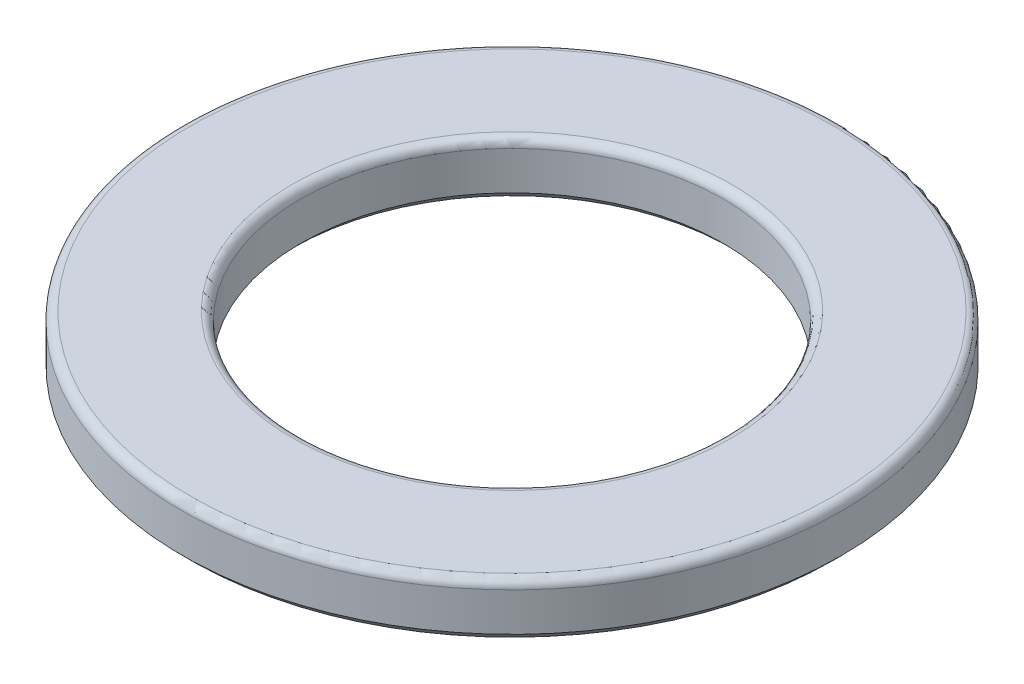
ISO-10303-21;
HEADER;
FILE_DESCRIPTION(('STEP AP214'),'2;1');
FILE_NAME('part.step','',(''),(''),'','','');
FILE_SCHEMA(('AUTOMOTIVE_DESIGN { 1 0 10303 214 1 1 1 1 }'));
ENDSEC;
DATA;
#1=APPLICATION_CONTEXT('core data for automotive mechanical design processes');
#2=APPLICATION_PROTOCOL_DEFINITION('international standard','automotive_design',2000,#1);
#3=PRODUCT_CONTEXT('',#1,'mechanical');
#4=PRODUCT('Part','Part','',(#3));
#5=PRODUCT_RELATED_PRODUCT_CATEGORY('part','',(#4));
#6=PRODUCT_DEFINITION_FORMATION('','',#4);
#7=PRODUCT_DEFINITION_CONTEXT('part definition',#1,'design');
#8=PRODUCT_DEFINITION('design','',#6,#7);
#9=PRODUCT_DEFINITION_SHAPE('','',#8);
#10=(LENGTH_UNIT() NAMED_UNIT(*) SI_UNIT(.MILLI.,.METRE.));
#11=(NAMED_UNIT(*) PLANE_ANGLE_UNIT() SI_UNIT($,.RADIAN.));
#12=(NAMED_UNIT(*) SI_UNIT($,.STERADIAN.) SOLID_ANGLE_UNIT());
#13=UNCERTAINTY_MEASURE_WITH_UNIT(LENGTH_MEASURE(1.E-05),#10,'distance_accuracy_value','');
#14=(GEOMETRIC_REPRESENTATION_CONTEXT(3) GLOBAL_UNCERTAINTY_ASSIGNED_CONTEXT((#13)) GLOBAL_UNIT_ASSIGNED_CONTEXT((#10,
#11,#12)) REPRESENTATION_CONTEXT('',''));
#15=CARTESIAN_POINT('',(0.,0.,0.));
#16=DIRECTION('',(0.,0.,1.));
#17=DIRECTION('',(1.,0.,0.));
#18=AXIS2_PLACEMENT_3D('',#15,#16,#17);
#19=CARTESIAN_POINT('',(32.,22.,0.));
#20=DIRECTION('',(0.,1.,0.));
#21=DIRECTION('',(-1.,0.,0.));
#22=AXIS2_PLACEMENT_3D('',#19,#20,#21);
#23=PLANE('',#22);
#24=CARTESIAN_POINT('',(0.,22.,0.));
#25=DIRECTION('',(0.,-1.,0.));
#26=DIRECTION('',(1.,0.,0.));
#27=AXIS2_PLACEMENT_3D('',#24,#25,#26);
#28=CIRCLE('',#27,26.);
#29=CARTESIAN_POINT('',(26.,22.,0.));
#30=VERTEX_POINT('',#29);
#31=EDGE_CURVE('E11',#30,#30,#28,.T.);
#32=ORIENTED_EDGE('',*,*,#31,.T.);
#33=EDGE_LOOP('',(#32));
#34=FACE_BOUND('',#33,.T.);
#35=CARTESIAN_POINT('',(0.,22.,0.));
#36=DIRECTION('',(0.,-1.,0.));
#37=DIRECTION('',(1.,0.,0.));
#38=AXIS2_PLACEMENT_3D('',#35,#36,#37);
#39=CIRCLE('',#38,38.);
#40=CARTESIAN_POINT('',(38.,22.,0.));
#41=VERTEX_POINT('',#40);
#42=EDGE_CURVE('E67',#41,#41,#39,.T.);
#43=ORIENTED_EDGE('',*,*,#42,.F.);
#44=EDGE_LOOP('',(#43));
#45=FACE_BOUND('',#44,.T.);
#46=ADVANCED_FACE('F17',(#34,#45),#23,.T.);
#47=CARTESIAN_POINT('',(0.,21.,0.));
#48=DIRECTION('',(0.,-1.,0.));
#49=DIRECTION('',(0.,0.,-1.));
#50=AXIS2_PLACEMENT_3D('',#47,#48,#49);
#51=TOROIDAL_SURFACE('',#50,26.,1.);
#52=CARTESIAN_POINT('',(0.,21.,0.));
#53=DIRECTION('',(0.,-1.,0.));
#54=DIRECTION('',(1.,0.,0.));
#55=AXIS2_PLACEMENT_3D('',#52,#53,#54);
#56=CIRCLE('',#55,25.);
#57=CARTESIAN_POINT('',(25.,21.,0.));
#58=VERTEX_POINT('',#57);
#59=EDGE_CURVE('E26',#58,#58,#56,.T.);
#60=ORIENTED_EDGE('',*,*,#59,.T.);
#61=EDGE_LOOP('',(#60));
#62=FACE_BOUND('',#61,.T.);
#63=ORIENTED_EDGE('',*,*,#31,.F.);
#64=EDGE_LOOP('',(#63));
#65=FACE_BOUND('',#64,.T.);
#66=ADVANCED_FACE('F104',(#62,#65),#51,.T.);
#67=CARTESIAN_POINT('',(0.,18.7224,0.));
#68=DIRECTION('',(0.,1.,0.));
#69=DIRECTION('',(1.,0.,0.));
#70=AXIS2_PLACEMENT_3D('',#67,#68,#69);
#71=CYLINDRICAL_SURFACE('',#70,25.);
#72=CARTESIAN_POINT('',(0.,16.4448,0.));
#73=DIRECTION('',(0.,-1.,0.));
#74=DIRECTION('',(1.,0.,0.));
#75=AXIS2_PLACEMENT_3D('',#72,#73,#74);
#76=CIRCLE('',#75,25.);
#77=CARTESIAN_POINT('',(25.,16.4448,0.));
#78=VERTEX_POINT('',#77);
#79=EDGE_CURVE('E75',#78,#78,#76,.T.);
#80=ORIENTED_EDGE('',*,*,#79,.T.);
#81=EDGE_LOOP('',(#80));
#82=FACE_BOUND('',#81,.T.);
#83=ORIENTED_EDGE('',*,*,#59,.F.);
#84=EDGE_LOOP('',(#83));
#85=FACE_BOUND('',#84,.T.);
#86=ADVANCED_FACE('F108',(#82,#85),#71,.F.);
#87=CARTESIAN_POINT('',(0.,15.9448,0.));
#88=DIRECTION('',(0.,-1.,0.));
#89=DIRECTION('',(1.,0.,0.));
#90=AXIS2_PLACEMENT_3D('',#87,#88,#89);
#91=CONICAL_SURFACE('',#90,25.5,0.78539816339745);
#92=CARTESIAN_POINT('',(0.,15.4448,0.));
#93=DIRECTION('',(0.,-1.,0.));
#94=DIRECTION('',(1.,0.,0.));
#95=AXIS2_PLACEMENT_3D('',#92,#93,#94);
#96=CIRCLE('',#95,26.);
#97=CARTESIAN_POINT('',(26.,15.4448,0.));
#98=VERTEX_POINT('',#97);
#99=EDGE_CURVE('E78',#98,#98,#96,.T.);
#100=ORIENTED_EDGE('',*,*,#99,.T.);
#101=EDGE_LOOP('',(#100));
#102=FACE_BOUND('',#101,.T.);
#103=ORIENTED_EDGE('',*,*,#79,.F.);
#104=EDGE_LOOP('',(#103));
#105=FACE_BOUND('',#104,.T.);
#106=ADVANCED_FACE('F115',(#102,#105),#91,.F.);
#107=CARTESIAN_POINT('',(27.3332,15.4448,0.));
#108=DIRECTION('',(0.,-1.,0.));
#109=DIRECTION('',(1.,0.,0.));
#110=AXIS2_PLACEMENT_3D('',#107,#108,#109);
#111=PLANE('',#110);
#112=CARTESIAN_POINT('',(0.,15.4448,0.));
#113=DIRECTION('',(0.,-1.,0.));
#114=DIRECTION('',(1.,0.,0.));
#115=AXIS2_PLACEMENT_3D('',#112,#113,#114);
#116=CIRCLE('',#115,28.6664);
#117=CARTESIAN_POINT('',(28.6664,15.4448,0.));
#118=VERTEX_POINT('',#117);
#119=EDGE_CURVE('E54',#118,#118,#116,.T.);
#120=ORIENTED_EDGE('',*,*,#119,.T.);
#121=EDGE_LOOP('',(#120));
#122=FACE_BOUND('',#121,.T.);
#123=ORIENTED_EDGE('',*,*,#99,.F.);
#124=EDGE_LOOP('',(#123));
#125=FACE_BOUND('',#124,.T.);
#126=ADVANCED_FACE('F120',(#122,#125),#111,.T.);
#127=CARTESIAN_POINT('',(0.,11.,0.));
#128=DIRECTION('',(0.,-1.,0.));
#129=DIRECTION('',(0.,0.,-1.));
#130=AXIS2_PLACEMENT_3D('',#127,#128,#129);
#131=TOROIDAL_SURFACE('',#130,32.,5.556);
#132=CARTESIAN_POINT('',(0.,15.4448,0.));
#133=DIRECTION('',(0.,-1.,0.));
#134=DIRECTION('',(1.,0.,0.));
#135=AXIS2_PLACEMENT_3D('',#132,#133,#134);
#136=CIRCLE('',#135,35.3336);
#137=CARTESIAN_POINT('',(35.3336,15.4448,0.));
#138=VERTEX_POINT('',#137);
#139=EDGE_CURVE('E58',#138,#138,#136,.T.);
#140=ORIENTED_EDGE('',*,*,#139,.T.);
#141=EDGE_LOOP('',(#140));
#142=FACE_BOUND('',#141,.T.);
#143=ORIENTED_EDGE('',*,*,#119,.F.);
#144=EDGE_LOOP('',(#143));
#145=FACE_BOUND('',#144,.T.);
#146=ADVANCED_FACE('F124',(#142,#145),#131,.F.);
#147=CARTESIAN_POINT('',(36.6668,15.4448,0.));
#148=DIRECTION('',(0.,-1.,0.));
#149=DIRECTION('',(1.,0.,0.));
#150=AXIS2_PLACEMENT_3D('',#147,#148,#149);
#151=PLANE('',#150);
#152=CARTESIAN_POINT('',(0.,15.4448,0.));
#153=DIRECTION('',(0.,-1.,0.));
#154=DIRECTION('',(1.,0.,0.));
#155=AXIS2_PLACEMENT_3D('',#152,#153,#154);
#156=CIRCLE('',#155,38.);
#157=CARTESIAN_POINT('',(38.,15.4448,0.));
#158=VERTEX_POINT('',#157);
#159=EDGE_CURVE('E20',#158,#158,#156,.T.);
#160=ORIENTED_EDGE('',*,*,#159,.T.);
#161=EDGE_LOOP('',(#160));
#162=FACE_BOUND('',#161,.T.);
#163=ORIENTED_EDGE('',*,*,#139,.F.);
#164=EDGE_LOOP('',(#163));
#165=FACE_BOUND('',#164,.T.);
#166=ADVANCED_FACE('F62',(#162,#165),#151,.T.);
#167=CARTESIAN_POINT('',(0.,15.9448,0.));
#168=DIRECTION('',(0.,1.,0.));
#169=DIRECTION('',(1.,0.,0.));
#170=AXIS2_PLACEMENT_3D('',#167,#168,#169);
#171=CONICAL_SURFACE('',#170,38.5,0.785398163397452);
#172=CARTESIAN_POINT('',(0.,16.4448,0.));
#173=DIRECTION('',(0.,-1.,0.));
#174=DIRECTION('',(1.,0.,0.));
#175=AXIS2_PLACEMENT_3D('',#172,#173,#174);
#176=CIRCLE('',#175,39.);
#177=CARTESIAN_POINT('',(39.,16.4448,0.));
#178=VERTEX_POINT('',#177);
#179=EDGE_CURVE('E65',#178,#178,#176,.T.);
#180=ORIENTED_EDGE('',*,*,#179,.T.);
#181=EDGE_LOOP('',(#180));
#182=FACE_BOUND('',#181,.T.);
#183=ORIENTED_EDGE('',*,*,#159,.F.);
#184=EDGE_LOOP('',(#183));
#185=FACE_BOUND('',#184,.T.);
#186=ADVANCED_FACE('F99',(#182,#185),#171,.T.);
#187=CARTESIAN_POINT('',(0.,18.7224,0.));
#188=DIRECTION('',(0.,1.,0.));
#189=DIRECTION('',(1.,0.,0.));
#190=AXIS2_PLACEMENT_3D('',#187,#188,#189);
#191=CYLINDRICAL_SURFACE('',#190,39.);
#192=CARTESIAN_POINT('',(0.,21.,0.));
#193=DIRECTION('',(0.,-1.,0.));
#194=DIRECTION('',(1.,0.,0.));
#195=AXIS2_PLACEMENT_3D('',#192,#193,#194);
#196=CIRCLE('',#195,39.);
#197=CARTESIAN_POINT('',(39.,21.,0.));
#198=VERTEX_POINT('',#197);
#199=EDGE_CURVE('E72',#198,#198,#196,.T.);
#200=ORIENTED_EDGE('',*,*,#199,.T.);
#201=EDGE_LOOP('',(#200));
#202=FACE_BOUND('',#201,.T.);
#203=ORIENTED_EDGE('',*,*,#179,.F.);
#204=EDGE_LOOP('',(#203));
#205=FACE_BOUND('',#204,.T.);
#206=ADVANCED_FACE('F88',(#202,#205),#191,.T.);
#207=CARTESIAN_POINT('',(0.,21.,0.));
#208=DIRECTION('',(0.,-1.,0.));
#209=DIRECTION('',(0.,0.,-1.));
#210=AXIS2_PLACEMENT_3D('',#207,#208,#209);
#211=TOROIDAL_SURFACE('',#210,38.,1.);
#212=ORIENTED_EDGE('',*,*,#42,.T.);
#213=EDGE_LOOP('',(#212));
#214=FACE_BOUND('',#213,.T.);
#215=ORIENTED_EDGE('',*,*,#199,.F.);
#216=EDGE_LOOP('',(#215));
#217=FACE_BOUND('',#216,.T.);
#218=ADVANCED_FACE('F91',(#214,#217),#211,.T.);
#219=CLOSED_SHELL('',(#46,#66,#86,#106,#126,#146,#166,#186,#206,#218));
#220=MANIFOLD_SOLID_BREP('B1',#219);
#221=ADVANCED_BREP_SHAPE_REPRESENTATION('',(#18,#220),#14);
#222=SHAPE_DEFINITION_REPRESENTATION(#9,#221);
ENDSEC;
END-ISO-10303-21;
